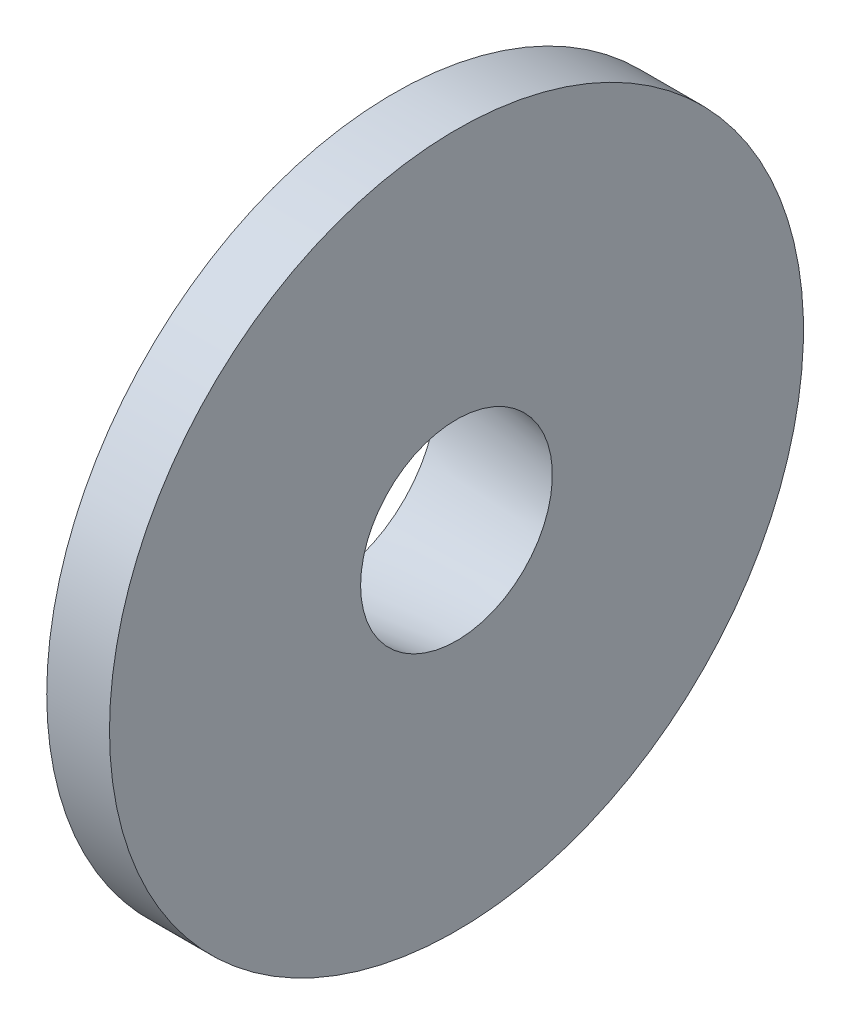
ISO-10303-21;
HEADER;
FILE_DESCRIPTION(('STEP AP214'),'2;1');
FILE_NAME('part.step','',(''),(''),'','','');
FILE_SCHEMA(('AUTOMOTIVE_DESIGN { 1 0 10303 214 1 1 1 1 }'));
ENDSEC;
DATA;
#1=APPLICATION_CONTEXT('core data for automotive mechanical design processes');
#2=APPLICATION_PROTOCOL_DEFINITION('international standard','automotive_design',2000,#1);
#3=PRODUCT_CONTEXT('',#1,'mechanical');
#4=PRODUCT('Part','Part','',(#3));
#5=PRODUCT_RELATED_PRODUCT_CATEGORY('part','',(#4));
#6=PRODUCT_DEFINITION_FORMATION('','',#4);
#7=PRODUCT_DEFINITION_CONTEXT('part definition',#1,'design');
#8=PRODUCT_DEFINITION('design','',#6,#7);
#9=PRODUCT_DEFINITION_SHAPE('','',#8);
#10=(LENGTH_UNIT() NAMED_UNIT(*) SI_UNIT(.MILLI.,.METRE.));
#11=(NAMED_UNIT(*) PLANE_ANGLE_UNIT() SI_UNIT($,.RADIAN.));
#12=(NAMED_UNIT(*) SI_UNIT($,.STERADIAN.) SOLID_ANGLE_UNIT());
#13=UNCERTAINTY_MEASURE_WITH_UNIT(LENGTH_MEASURE(1.E-05),#10,'distance_accuracy_value','');
#14=(GEOMETRIC_REPRESENTATION_CONTEXT(3) GLOBAL_UNCERTAINTY_ASSIGNED_CONTEXT((#13)) GLOBAL_UNIT_ASSIGNED_CONTEXT((#10,
#11,#12)) REPRESENTATION_CONTEXT('',''));
#15=CARTESIAN_POINT('',(0.,0.,0.));
#16=DIRECTION('',(0.,0.,1.));
#17=DIRECTION('',(1.,0.,0.));
#18=AXIS2_PLACEMENT_3D('',#15,#16,#17);
#19=CARTESIAN_POINT('',(0.,0.,0.));
#20=DIRECTION('',(-1.,0.,0.));
#21=DIRECTION('',(0.,0.,1.));
#22=AXIS2_PLACEMENT_3D('',#19,#20,#21);
#23=CONICAL_SURFACE('',#22,17.9,0.124354994546764);
#24=CARTESIAN_POINT('',(21.,0.,0.));
#25=DIRECTION('',(-1.,0.,0.));
#26=DIRECTION('',(0.,0.,1.));
#27=AXIS2_PLACEMENT_3D('',#24,#25,#26);
#28=CIRCLE('',#27,15.2749999999999);
#29=CARTESIAN_POINT('',(21.,0.,15.2749999999999));
#30=VERTEX_POINT('',#29);
#31=EDGE_CURVE('E58',#30,#30,#28,.T.);
#32=ORIENTED_EDGE('',*,*,#31,.F.);
#33=EDGE_LOOP('',(#32));
#34=FACE_BOUND('',#33,.T.);
#35=CARTESIAN_POINT('',(0.,0.,0.));
#36=DIRECTION('',(-1.,0.,0.));
#37=DIRECTION('',(0.,0.,1.));
#38=AXIS2_PLACEMENT_3D('',#35,#36,#37);
#39=CIRCLE('',#38,17.9);
#40=CARTESIAN_POINT('',(0.,0.,17.9));
#41=VERTEX_POINT('',#40);
#42=EDGE_CURVE('E12',#41,#41,#39,.T.);
#43=ORIENTED_EDGE('',*,*,#42,.T.);
#44=EDGE_LOOP('',(#43));
#45=FACE_BOUND('',#44,.T.);
#46=ADVANCED_FACE('F39',(#34,#45),#23,.F.);
#47=CARTESIAN_POINT('',(0.,17.9,0.));
#48=DIRECTION('',(1.,0.,0.));
#49=DIRECTION('',(0.,0.,-1.));
#50=AXIS2_PLACEMENT_3D('',#47,#48,#49);
#51=PLANE('',#50);
#52=ORIENTED_EDGE('',*,*,#42,.F.);
#53=EDGE_LOOP('',(#52));
#54=FACE_BOUND('',#53,.T.);
#55=CARTESIAN_POINT('',(0.,0.,0.));
#56=DIRECTION('',(-1.,0.,0.));
#57=DIRECTION('',(0.,0.,1.));
#58=AXIS2_PLACEMENT_3D('',#55,#56,#57);
#59=CIRCLE('',#58,31.9);
#60=CARTESIAN_POINT('',(0.,0.,31.9));
#61=VERTEX_POINT('',#60);
#62=EDGE_CURVE('E45',#61,#61,#59,.T.);
#63=ORIENTED_EDGE('',*,*,#62,.T.);
#64=EDGE_LOOP('',(#63));
#65=FACE_BOUND('',#64,.T.);
#66=ADVANCED_FACE('F65',(#54,#65),#51,.F.);
#67=CARTESIAN_POINT('',(11.,0.,0.));
#68=DIRECTION('',(1.,0.,0.));
#69=DIRECTION('',(0.,0.,-1.));
#70=AXIS2_PLACEMENT_3D('',#67,#68,#69);
#71=CONICAL_SURFACE('',#70,55.2749999999999,1.13095374397916);
#72=ORIENTED_EDGE('',*,*,#62,.F.);
#73=EDGE_LOOP('',(#72));
#74=FACE_BOUND('',#73,.T.);
#75=CARTESIAN_POINT('',(11.,0.,0.));
#76=DIRECTION('',(-1.,0.,0.));
#77=DIRECTION('',(0.,0.,1.));
#78=AXIS2_PLACEMENT_3D('',#75,#76,#77);
#79=CIRCLE('',#78,55.2749999999999);
#80=CARTESIAN_POINT('',(11.,0.,55.2749999999999));
#81=VERTEX_POINT('',#80);
#82=EDGE_CURVE('E49',#81,#81,#79,.T.);
#83=ORIENTED_EDGE('',*,*,#82,.T.);
#84=EDGE_LOOP('',(#83));
#85=FACE_BOUND('',#84,.T.);
#86=ADVANCED_FACE('F69',(#74,#85),#71,.T.);
#87=CARTESIAN_POINT('',(138.595599426437,0.,0.));
#88=DIRECTION('',(-1.,0.,0.));
#89=DIRECTION('',(0.,0.,1.));
#90=AXIS2_PLACEMENT_3D('',#87,#88,#89);
#91=CYLINDRICAL_SURFACE('',#90,55.2749999999999);
#92=ORIENTED_EDGE('',*,*,#82,.F.);
#93=EDGE_LOOP('',(#92));
#94=FACE_BOUND('',#93,.T.);
#95=CARTESIAN_POINT('',(21.,0.,0.));
#96=DIRECTION('',(-1.,0.,0.));
#97=DIRECTION('',(0.,0.,1.));
#98=AXIS2_PLACEMENT_3D('',#95,#96,#97);
#99=CIRCLE('',#98,55.2749999999999);
#100=CARTESIAN_POINT('',(21.,0.,55.2749999999999));
#101=VERTEX_POINT('',#100);
#102=EDGE_CURVE('E53',#101,#101,#99,.T.);
#103=ORIENTED_EDGE('',*,*,#102,.T.);
#104=EDGE_LOOP('',(#103));
#105=FACE_BOUND('',#104,.T.);
#106=ADVANCED_FACE('F74',(#94,#105),#91,.T.);
#107=CARTESIAN_POINT('',(21.,55.2749999999999,0.));
#108=DIRECTION('',(-1.,0.,0.));
#109=DIRECTION('',(0.,0.,1.));
#110=AXIS2_PLACEMENT_3D('',#107,#108,#109);
#111=PLANE('',#110);
#112=ORIENTED_EDGE('',*,*,#102,.F.);
#113=EDGE_LOOP('',(#112));
#114=FACE_BOUND('',#113,.T.);
#115=ORIENTED_EDGE('',*,*,#31,.T.);
#116=EDGE_LOOP('',(#115));
#117=FACE_BOUND('',#116,.T.);
#118=ADVANCED_FACE('F62',(#114,#117),#111,.F.);
#119=CLOSED_SHELL('',(#46,#66,#86,#106,#118));
#120=MANIFOLD_SOLID_BREP('B2',#119);
#121=ADVANCED_BREP_SHAPE_REPRESENTATION('',(#18,#120),#14);
#122=SHAPE_DEFINITION_REPRESENTATION(#9,#121);
ENDSEC;
END-ISO-10303-21;
